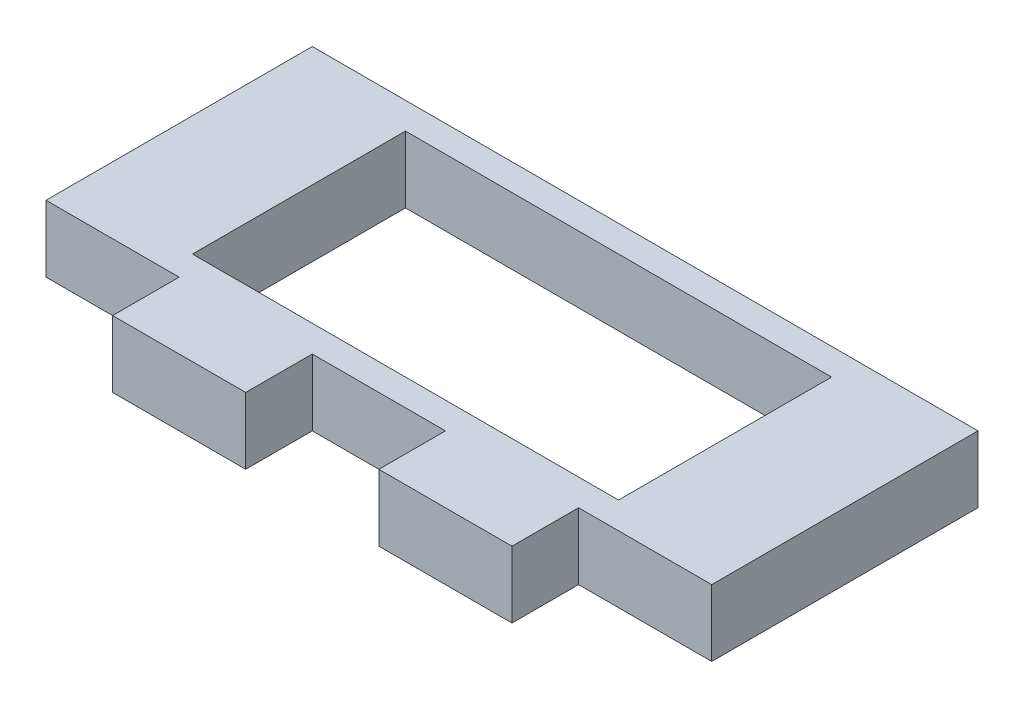
ISO-10303-21;
HEADER;
FILE_DESCRIPTION(('STEP AP214'),'2;1');
FILE_NAME('part.step','',(''),(''),'','','');
FILE_SCHEMA(('AUTOMOTIVE_DESIGN { 1 0 10303 214 1 1 1 1 }'));
ENDSEC;
DATA;
#1=APPLICATION_CONTEXT('core data for automotive mechanical design processes');
#2=APPLICATION_PROTOCOL_DEFINITION('international standard','automotive_design',2000,#1);
#3=PRODUCT_CONTEXT('',#1,'mechanical');
#4=PRODUCT('Part','Part','',(#3));
#5=PRODUCT_RELATED_PRODUCT_CATEGORY('part','',(#4));
#6=PRODUCT_DEFINITION_FORMATION('','',#4);
#7=PRODUCT_DEFINITION_CONTEXT('part definition',#1,'design');
#8=PRODUCT_DEFINITION('design','',#6,#7);
#9=PRODUCT_DEFINITION_SHAPE('','',#8);
#10=(LENGTH_UNIT() NAMED_UNIT(*) SI_UNIT(.MILLI.,.METRE.));
#11=(NAMED_UNIT(*) PLANE_ANGLE_UNIT() SI_UNIT($,.RADIAN.));
#12=(NAMED_UNIT(*) SI_UNIT($,.STERADIAN.) SOLID_ANGLE_UNIT());
#13=UNCERTAINTY_MEASURE_WITH_UNIT(LENGTH_MEASURE(1.E-05),#10,'distance_accuracy_value','');
#14=(GEOMETRIC_REPRESENTATION_CONTEXT(3) GLOBAL_UNCERTAINTY_ASSIGNED_CONTEXT((#13)) GLOBAL_UNIT_ASSIGNED_CONTEXT((#10,
#11,#12)) REPRESENTATION_CONTEXT('',''));
#15=CARTESIAN_POINT('',(0.,0.,0.));
#16=DIRECTION('',(0.,0.,1.));
#17=DIRECTION('',(1.,0.,0.));
#18=AXIS2_PLACEMENT_3D('',#15,#16,#17);
#19=CARTESIAN_POINT('',(0.,6.35,0.));
#20=DIRECTION('',(0.,1.,0.));
#21=DIRECTION('',(0.,0.,1.));
#22=AXIS2_PLACEMENT_3D('',#19,#20,#21);
#23=PLANE('',#22);
#24=DIRECTION('',(0.,0.,1.));
#25=VECTOR('',#24,1.);
#26=CARTESIAN_POINT('',(-31.75,6.35,-12.7));
#27=LINE('',#26,#25);
#28=CARTESIAN_POINT('',(-31.75,6.35,-12.7));
#29=VERTEX_POINT('',#28);
#30=CARTESIAN_POINT('',(-31.75,6.35,12.7));
#31=VERTEX_POINT('',#30);
#32=EDGE_CURVE('E182',#29,#31,#27,.T.);
#33=ORIENTED_EDGE('',*,*,#32,.T.);
#34=DIRECTION('',(1.,0.,0.));
#35=VECTOR('',#34,1.);
#36=CARTESIAN_POINT('',(-31.75,6.35,12.7));
#37=LINE('',#36,#35);
#38=CARTESIAN_POINT('',(-19.05,6.35,12.7));
#39=VERTEX_POINT('',#38);
#40=EDGE_CURVE('E185',#31,#39,#37,.T.);
#41=ORIENTED_EDGE('',*,*,#40,.T.);
#42=DIRECTION('',(0.,0.,1.));
#43=VECTOR('',#42,1.);
#44=CARTESIAN_POINT('',(-19.05,6.35,12.7));
#45=LINE('',#44,#43);
#46=CARTESIAN_POINT('',(-19.05,6.35,19.05));
#47=VERTEX_POINT('',#46);
#48=EDGE_CURVE('E188',#39,#47,#45,.T.);
#49=ORIENTED_EDGE('',*,*,#48,.T.);
#50=DIRECTION('',(1.,0.,0.));
#51=VECTOR('',#50,1.);
#52=CARTESIAN_POINT('',(-19.05,6.35,19.05));
#53=LINE('',#52,#51);
#54=CARTESIAN_POINT('',(-6.35,6.35,19.05));
#55=VERTEX_POINT('',#54);
#56=EDGE_CURVE('E190',#47,#55,#53,.T.);
#57=ORIENTED_EDGE('',*,*,#56,.T.);
#58=DIRECTION('',(0.,0.,-1.));
#59=VECTOR('',#58,1.);
#60=CARTESIAN_POINT('',(-6.35,6.35,12.7));
#61=LINE('',#60,#59);
#62=CARTESIAN_POINT('',(-6.35,6.35,12.7));
#63=VERTEX_POINT('',#62);
#64=EDGE_CURVE('E192',#55,#63,#61,.T.);
#65=ORIENTED_EDGE('',*,*,#64,.T.);
#66=DIRECTION('',(1.,0.,0.));
#67=VECTOR('',#66,1.);
#68=CARTESIAN_POINT('',(-6.35,6.35,12.7));
#69=LINE('',#68,#67);
#70=CARTESIAN_POINT('',(6.35,6.35,12.7));
#71=VERTEX_POINT('',#70);
#72=EDGE_CURVE('E194',#63,#71,#69,.T.);
#73=ORIENTED_EDGE('',*,*,#72,.T.);
#74=DIRECTION('',(0.,0.,1.));
#75=VECTOR('',#74,1.);
#76=CARTESIAN_POINT('',(6.35,6.35,12.7));
#77=LINE('',#76,#75);
#78=CARTESIAN_POINT('',(6.35,6.35,19.05));
#79=VERTEX_POINT('',#78);
#80=EDGE_CURVE('E196',#71,#79,#77,.T.);
#81=ORIENTED_EDGE('',*,*,#80,.T.);
#82=DIRECTION('',(1.,0.,0.));
#83=VECTOR('',#82,1.);
#84=CARTESIAN_POINT('',(6.35,6.35,19.05));
#85=LINE('',#84,#83);
#86=CARTESIAN_POINT('',(19.05,6.35,19.05));
#87=VERTEX_POINT('',#86);
#88=EDGE_CURVE('E198',#79,#87,#85,.T.);
#89=ORIENTED_EDGE('',*,*,#88,.T.);
#90=DIRECTION('',(0.,0.,-1.));
#91=VECTOR('',#90,1.);
#92=CARTESIAN_POINT('',(19.05,6.35,12.7));
#93=LINE('',#92,#91);
#94=CARTESIAN_POINT('',(19.05,6.35,12.7));
#95=VERTEX_POINT('',#94);
#96=EDGE_CURVE('E200',#87,#95,#93,.T.);
#97=ORIENTED_EDGE('',*,*,#96,.T.);
#98=DIRECTION('',(1.,0.,0.));
#99=VECTOR('',#98,1.);
#100=CARTESIAN_POINT('',(19.05,6.35,12.7));
#101=LINE('',#100,#99);
#102=CARTESIAN_POINT('',(31.75,6.35,12.7));
#103=VERTEX_POINT('',#102);
#104=EDGE_CURVE('E202',#95,#103,#101,.T.);
#105=ORIENTED_EDGE('',*,*,#104,.T.);
#106=DIRECTION('',(0.,0.,-1.));
#107=VECTOR('',#106,1.);
#108=CARTESIAN_POINT('',(31.75,6.35,-12.7));
#109=LINE('',#108,#107);
#110=CARTESIAN_POINT('',(31.75,6.35,-12.7));
#111=VERTEX_POINT('',#110);
#112=EDGE_CURVE('E204',#103,#111,#109,.T.);
#113=ORIENTED_EDGE('',*,*,#112,.T.);
#114=DIRECTION('',(-1.,0.,0.));
#115=VECTOR('',#114,1.);
#116=CARTESIAN_POINT('',(-31.75,6.35,-12.7));
#117=LINE('',#116,#115);
#118=EDGE_CURVE('E206',#111,#29,#117,.T.);
#119=ORIENTED_EDGE('',*,*,#118,.T.);
#120=EDGE_LOOP('',(#33,#41,#49,#57,#65,#73,#81,#89,#97,#105,#113,#119));
#121=FACE_BOUND('',#120,.T.);
#122=DIRECTION('',(1.,0.,0.));
#123=VECTOR('',#122,1.);
#124=CARTESIAN_POINT('',(-20.32,6.35,10.16));
#125=LINE('',#124,#123);
#126=CARTESIAN_POINT('',(-20.32,6.35,10.16));
#127=VERTEX_POINT('',#126);
#128=CARTESIAN_POINT('',(20.32,6.35,10.16));
#129=VERTEX_POINT('',#128);
#130=EDGE_CURVE('E154',#127,#129,#125,.T.);
#131=ORIENTED_EDGE('',*,*,#130,.F.);
#132=DIRECTION('',(0.,0.,1.));
#133=VECTOR('',#132,1.);
#134=CARTESIAN_POINT('',(-20.32,6.35,-10.16));
#135=LINE('',#134,#133);
#136=CARTESIAN_POINT('',(-20.32,6.35,-10.16));
#137=VERTEX_POINT('',#136);
#138=EDGE_CURVE('E146',#137,#127,#135,.T.);
#139=ORIENTED_EDGE('',*,*,#138,.F.);
#140=DIRECTION('',(-1.,0.,0.));
#141=VECTOR('',#140,1.);
#142=CARTESIAN_POINT('',(-20.32,6.35,-10.16));
#143=LINE('',#142,#141);
#144=CARTESIAN_POINT('',(20.32,6.35,-10.16));
#145=VERTEX_POINT('',#144);
#146=EDGE_CURVE('E168',#145,#137,#143,.T.);
#147=ORIENTED_EDGE('',*,*,#146,.F.);
#148=DIRECTION('',(0.,0.,-1.));
#149=VECTOR('',#148,1.);
#150=CARTESIAN_POINT('',(20.32,6.35,-10.16));
#151=LINE('',#150,#149);
#152=EDGE_CURVE('E166',#129,#145,#151,.T.);
#153=ORIENTED_EDGE('',*,*,#152,.F.);
#154=EDGE_LOOP('',(#131,#139,#147,#153));
#155=FACE_BOUND('',#154,.T.);
#156=ADVANCED_FACE('F33',(#121,#155),#23,.T.);
#157=CARTESIAN_POINT('',(0.,0.,0.));
#158=DIRECTION('',(0.,1.,0.));
#159=DIRECTION('',(0.,0.,1.));
#160=AXIS2_PLACEMENT_3D('',#157,#158,#159);
#161=PLANE('',#160);
#162=DIRECTION('',(0.,0.,1.));
#163=VECTOR('',#162,1.);
#164=CARTESIAN_POINT('',(-31.75,0.,-12.7));
#165=LINE('',#164,#163);
#166=CARTESIAN_POINT('',(-31.75,0.,-12.7));
#167=VERTEX_POINT('',#166);
#168=CARTESIAN_POINT('',(-31.75,0.,12.7));
#169=VERTEX_POINT('',#168);
#170=EDGE_CURVE('E162',#167,#169,#165,.T.);
#171=ORIENTED_EDGE('',*,*,#170,.F.);
#172=DIRECTION('',(-1.,0.,0.));
#173=VECTOR('',#172,1.);
#174=CARTESIAN_POINT('',(-31.75,0.,-12.7));
#175=LINE('',#174,#173);
#176=CARTESIAN_POINT('',(31.75,0.,-12.7));
#177=VERTEX_POINT('',#176);
#178=EDGE_CURVE('E186',#177,#167,#175,.T.);
#179=ORIENTED_EDGE('',*,*,#178,.F.);
#180=DIRECTION('',(0.,0.,-1.));
#181=VECTOR('',#180,1.);
#182=CARTESIAN_POINT('',(31.75,0.,-12.7));
#183=LINE('',#182,#181);
#184=CARTESIAN_POINT('',(31.75,0.,12.7));
#185=VERTEX_POINT('',#184);
#186=EDGE_CURVE('E229',#185,#177,#183,.T.);
#187=ORIENTED_EDGE('',*,*,#186,.F.);
#188=DIRECTION('',(1.,0.,0.));
#189=VECTOR('',#188,1.);
#190=CARTESIAN_POINT('',(19.05,0.,12.7));
#191=LINE('',#190,#189);
#192=CARTESIAN_POINT('',(19.05,0.,12.7));
#193=VERTEX_POINT('',#192);
#194=EDGE_CURVE('E227',#193,#185,#191,.T.);
#195=ORIENTED_EDGE('',*,*,#194,.F.);
#196=DIRECTION('',(0.,0.,-1.));
#197=VECTOR('',#196,1.);
#198=CARTESIAN_POINT('',(19.05,0.,12.7));
#199=LINE('',#198,#197);
#200=CARTESIAN_POINT('',(19.05,0.,19.05));
#201=VERTEX_POINT('',#200);
#202=EDGE_CURVE('E225',#201,#193,#199,.T.);
#203=ORIENTED_EDGE('',*,*,#202,.F.);
#204=DIRECTION('',(1.,0.,0.));
#205=VECTOR('',#204,1.);
#206=CARTESIAN_POINT('',(6.35,0.,19.05));
#207=LINE('',#206,#205);
#208=CARTESIAN_POINT('',(6.35,0.,19.05));
#209=VERTEX_POINT('',#208);
#210=EDGE_CURVE('E223',#209,#201,#207,.T.);
#211=ORIENTED_EDGE('',*,*,#210,.F.);
#212=DIRECTION('',(0.,0.,1.));
#213=VECTOR('',#212,1.);
#214=CARTESIAN_POINT('',(6.35,0.,12.7));
#215=LINE('',#214,#213);
#216=CARTESIAN_POINT('',(6.35,0.,12.7));
#217=VERTEX_POINT('',#216);
#218=EDGE_CURVE('E221',#217,#209,#215,.T.);
#219=ORIENTED_EDGE('',*,*,#218,.F.);
#220=DIRECTION('',(1.,0.,0.));
#221=VECTOR('',#220,1.);
#222=CARTESIAN_POINT('',(-6.35,0.,12.7));
#223=LINE('',#222,#221);
#224=CARTESIAN_POINT('',(-6.35,0.,12.7));
#225=VERTEX_POINT('',#224);
#226=EDGE_CURVE('E219',#225,#217,#223,.T.);
#227=ORIENTED_EDGE('',*,*,#226,.F.);
#228=DIRECTION('',(0.,0.,-1.));
#229=VECTOR('',#228,1.);
#230=CARTESIAN_POINT('',(-6.35,0.,12.7));
#231=LINE('',#230,#229);
#232=CARTESIAN_POINT('',(-6.35,0.,19.05));
#233=VERTEX_POINT('',#232);
#234=EDGE_CURVE('E217',#233,#225,#231,.T.);
#235=ORIENTED_EDGE('',*,*,#234,.F.);
#236=DIRECTION('',(1.,0.,0.));
#237=VECTOR('',#236,1.);
#238=CARTESIAN_POINT('',(-19.05,0.,19.05));
#239=LINE('',#238,#237);
#240=CARTESIAN_POINT('',(-19.05,0.,19.05));
#241=VERTEX_POINT('',#240);
#242=EDGE_CURVE('E215',#241,#233,#239,.T.);
#243=ORIENTED_EDGE('',*,*,#242,.F.);
#244=DIRECTION('',(0.,0.,1.));
#245=VECTOR('',#244,1.);
#246=CARTESIAN_POINT('',(-19.05,0.,12.7));
#247=LINE('',#246,#245);
#248=CARTESIAN_POINT('',(-19.05,0.,12.7));
#249=VERTEX_POINT('',#248);
#250=EDGE_CURVE('E213',#249,#241,#247,.T.);
#251=ORIENTED_EDGE('',*,*,#250,.F.);
#252=DIRECTION('',(1.,0.,0.));
#253=VECTOR('',#252,1.);
#254=CARTESIAN_POINT('',(-31.75,0.,12.7));
#255=LINE('',#254,#253);
#256=EDGE_CURVE('E211',#169,#249,#255,.T.);
#257=ORIENTED_EDGE('',*,*,#256,.F.);
#258=EDGE_LOOP('',(#171,#179,#187,#195,#203,#211,#219,#227,#235,#243,#251,#257));
#259=FACE_BOUND('',#258,.T.);
#260=DIRECTION('',(0.,0.,1.));
#261=VECTOR('',#260,1.);
#262=CARTESIAN_POINT('',(-20.32,0.,-10.16));
#263=LINE('',#262,#261);
#264=CARTESIAN_POINT('',(-20.32,0.,-10.16));
#265=VERTEX_POINT('',#264);
#266=CARTESIAN_POINT('',(-20.32,0.,10.16));
#267=VERTEX_POINT('',#266);
#268=EDGE_CURVE('E56',#265,#267,#263,.T.);
#269=ORIENTED_EDGE('',*,*,#268,.T.);
#270=DIRECTION('',(1.,0.,0.));
#271=VECTOR('',#270,1.);
#272=CARTESIAN_POINT('',(-20.32,0.,10.16));
#273=LINE('',#272,#271);
#274=CARTESIAN_POINT('',(20.32,0.,10.16));
#275=VERTEX_POINT('',#274);
#276=EDGE_CURVE('E161',#267,#275,#273,.T.);
#277=ORIENTED_EDGE('',*,*,#276,.T.);
#278=DIRECTION('',(0.,0.,-1.));
#279=VECTOR('',#278,1.);
#280=CARTESIAN_POINT('',(20.32,0.,-10.16));
#281=LINE('',#280,#279);
#282=CARTESIAN_POINT('',(20.32,0.,-10.16));
#283=VERTEX_POINT('',#282);
#284=EDGE_CURVE('E174',#275,#283,#281,.T.);
#285=ORIENTED_EDGE('',*,*,#284,.T.);
#286=DIRECTION('',(-1.,0.,0.));
#287=VECTOR('',#286,1.);
#288=CARTESIAN_POINT('',(-20.32,0.,-10.16));
#289=LINE('',#288,#287);
#290=EDGE_CURVE('E155',#283,#265,#289,.T.);
#291=ORIENTED_EDGE('',*,*,#290,.T.);
#292=EDGE_LOOP('',(#269,#277,#285,#291));
#293=FACE_BOUND('',#292,.T.);
#294=ADVANCED_FACE('F271',(#259,#293),#161,.F.);
#295=CARTESIAN_POINT('',(-31.75,6.35,-12.7));
#296=DIRECTION('',(1.,0.,0.));
#297=DIRECTION('',(0.,0.,-1.));
#298=AXIS2_PLACEMENT_3D('',#295,#296,#297);
#299=PLANE('',#298);
#300=ORIENTED_EDGE('',*,*,#170,.T.);
#301=DIRECTION('',(0.,-1.,0.));
#302=VECTOR('',#301,1.);
#303=CARTESIAN_POINT('',(-31.75,6.35,12.7));
#304=LINE('',#303,#302);
#305=EDGE_CURVE('E11',#31,#169,#304,.T.);
#306=ORIENTED_EDGE('',*,*,#305,.F.);
#307=ORIENTED_EDGE('',*,*,#32,.F.);
#308=DIRECTION('',(0.,-1.,0.));
#309=VECTOR('',#308,1.);
#310=CARTESIAN_POINT('',(-31.75,6.35,-12.7));
#311=LINE('',#310,#309);
#312=EDGE_CURVE('E208',#29,#167,#311,.T.);
#313=ORIENTED_EDGE('',*,*,#312,.T.);
#314=EDGE_LOOP('',(#300,#306,#307,#313));
#315=FACE_BOUND('',#314,.T.);
#316=ADVANCED_FACE('F35',(#315),#299,.F.);
#317=CARTESIAN_POINT('',(-31.75,6.35,12.7));
#318=DIRECTION('',(0.,0.,-1.));
#319=DIRECTION('',(-1.,0.,0.));
#320=AXIS2_PLACEMENT_3D('',#317,#318,#319);
#321=PLANE('',#320);
#322=ORIENTED_EDGE('',*,*,#256,.T.);
#323=DIRECTION('',(0.,-1.,0.));
#324=VECTOR('',#323,1.);
#325=CARTESIAN_POINT('',(-19.05,6.35,12.7));
#326=LINE('',#325,#324);
#327=EDGE_CURVE('E41',#39,#249,#326,.T.);
#328=ORIENTED_EDGE('',*,*,#327,.F.);
#329=ORIENTED_EDGE('',*,*,#40,.F.);
#330=ORIENTED_EDGE('',*,*,#305,.T.);
#331=EDGE_LOOP('',(#322,#328,#329,#330));
#332=FACE_BOUND('',#331,.T.);
#333=ADVANCED_FACE('F288',(#332),#321,.F.);
#334=CARTESIAN_POINT('',(-19.05,6.35,12.7));
#335=DIRECTION('',(1.,0.,0.));
#336=DIRECTION('',(0.,0.,-1.));
#337=AXIS2_PLACEMENT_3D('',#334,#335,#336);
#338=PLANE('',#337);
#339=ORIENTED_EDGE('',*,*,#250,.T.);
#340=DIRECTION('',(0.,-1.,0.));
#341=VECTOR('',#340,1.);
#342=CARTESIAN_POINT('',(-19.05,6.35,19.05));
#343=LINE('',#342,#341);
#344=EDGE_CURVE('E258',#47,#241,#343,.T.);
#345=ORIENTED_EDGE('',*,*,#344,.F.);
#346=ORIENTED_EDGE('',*,*,#48,.F.);
#347=ORIENTED_EDGE('',*,*,#327,.T.);
#348=EDGE_LOOP('',(#339,#345,#346,#347));
#349=FACE_BOUND('',#348,.T.);
#350=ADVANCED_FACE('F265',(#349),#338,.F.);
#351=CARTESIAN_POINT('',(-19.05,6.35,19.05));
#352=DIRECTION('',(0.,0.,-1.));
#353=DIRECTION('',(-1.,0.,0.));
#354=AXIS2_PLACEMENT_3D('',#351,#352,#353);
#355=PLANE('',#354);
#356=ORIENTED_EDGE('',*,*,#242,.T.);
#357=DIRECTION('',(0.,-1.,0.));
#358=VECTOR('',#357,1.);
#359=CARTESIAN_POINT('',(-6.35,6.35,19.05));
#360=LINE('',#359,#358);
#361=EDGE_CURVE('E255',#55,#233,#360,.T.);
#362=ORIENTED_EDGE('',*,*,#361,.F.);
#363=ORIENTED_EDGE('',*,*,#56,.F.);
#364=ORIENTED_EDGE('',*,*,#344,.T.);
#365=EDGE_LOOP('',(#356,#362,#363,#364));
#366=FACE_BOUND('',#365,.T.);
#367=ADVANCED_FACE('F277',(#366),#355,.F.);
#368=CARTESIAN_POINT('',(-6.35,6.35,12.7));
#369=DIRECTION('',(-1.,0.,0.));
#370=DIRECTION('',(0.,0.,1.));
#371=AXIS2_PLACEMENT_3D('',#368,#369,#370);
#372=PLANE('',#371);
#373=ORIENTED_EDGE('',*,*,#234,.T.);
#374=DIRECTION('',(0.,-1.,0.));
#375=VECTOR('',#374,1.);
#376=CARTESIAN_POINT('',(-6.35,6.35,12.7));
#377=LINE('',#376,#375);
#378=EDGE_CURVE('E252',#63,#225,#377,.T.);
#379=ORIENTED_EDGE('',*,*,#378,.F.);
#380=ORIENTED_EDGE('',*,*,#64,.F.);
#381=ORIENTED_EDGE('',*,*,#361,.T.);
#382=EDGE_LOOP('',(#373,#379,#380,#381));
#383=FACE_BOUND('',#382,.T.);
#384=ADVANCED_FACE('F281',(#383),#372,.F.);
#385=CARTESIAN_POINT('',(-6.35,6.35,12.7));
#386=DIRECTION('',(0.,0.,-1.));
#387=DIRECTION('',(-1.,0.,0.));
#388=AXIS2_PLACEMENT_3D('',#385,#386,#387);
#389=PLANE('',#388);
#390=ORIENTED_EDGE('',*,*,#226,.T.);
#391=DIRECTION('',(0.,-1.,0.));
#392=VECTOR('',#391,1.);
#393=CARTESIAN_POINT('',(6.35,6.35,12.7));
#394=LINE('',#393,#392);
#395=EDGE_CURVE('E249',#71,#217,#394,.T.);
#396=ORIENTED_EDGE('',*,*,#395,.F.);
#397=ORIENTED_EDGE('',*,*,#72,.F.);
#398=ORIENTED_EDGE('',*,*,#378,.T.);
#399=EDGE_LOOP('',(#390,#396,#397,#398));
#400=FACE_BOUND('',#399,.T.);
#401=ADVANCED_FACE('F321',(#400),#389,.F.);
#402=CARTESIAN_POINT('',(6.35,6.35,12.7));
#403=DIRECTION('',(1.,0.,0.));
#404=DIRECTION('',(0.,0.,-1.));
#405=AXIS2_PLACEMENT_3D('',#402,#403,#404);
#406=PLANE('',#405);
#407=ORIENTED_EDGE('',*,*,#218,.T.);
#408=DIRECTION('',(0.,-1.,0.));
#409=VECTOR('',#408,1.);
#410=CARTESIAN_POINT('',(6.35,6.35,19.05));
#411=LINE('',#410,#409);
#412=EDGE_CURVE('E246',#79,#209,#411,.T.);
#413=ORIENTED_EDGE('',*,*,#412,.F.);
#414=ORIENTED_EDGE('',*,*,#80,.F.);
#415=ORIENTED_EDGE('',*,*,#395,.T.);
#416=EDGE_LOOP('',(#407,#413,#414,#415));
#417=FACE_BOUND('',#416,.T.);
#418=ADVANCED_FACE('F319',(#417),#406,.F.);
#419=CARTESIAN_POINT('',(6.35,6.35,19.05));
#420=DIRECTION('',(0.,0.,-1.));
#421=DIRECTION('',(-1.,0.,0.));
#422=AXIS2_PLACEMENT_3D('',#419,#420,#421);
#423=PLANE('',#422);
#424=ORIENTED_EDGE('',*,*,#210,.T.);
#425=DIRECTION('',(0.,-1.,0.));
#426=VECTOR('',#425,1.);
#427=CARTESIAN_POINT('',(19.05,6.35,19.05));
#428=LINE('',#427,#426);
#429=EDGE_CURVE('E243',#87,#201,#428,.T.);
#430=ORIENTED_EDGE('',*,*,#429,.F.);
#431=ORIENTED_EDGE('',*,*,#88,.F.);
#432=ORIENTED_EDGE('',*,*,#412,.T.);
#433=EDGE_LOOP('',(#424,#430,#431,#432));
#434=FACE_BOUND('',#433,.T.);
#435=ADVANCED_FACE('F315',(#434),#423,.F.);
#436=CARTESIAN_POINT('',(19.05,6.35,12.7));
#437=DIRECTION('',(-1.,0.,0.));
#438=DIRECTION('',(0.,0.,1.));
#439=AXIS2_PLACEMENT_3D('',#436,#437,#438);
#440=PLANE('',#439);
#441=ORIENTED_EDGE('',*,*,#202,.T.);
#442=DIRECTION('',(0.,-1.,0.));
#443=VECTOR('',#442,1.);
#444=CARTESIAN_POINT('',(19.05,6.35,12.7));
#445=LINE('',#444,#443);
#446=EDGE_CURVE('E240',#95,#193,#445,.T.);
#447=ORIENTED_EDGE('',*,*,#446,.F.);
#448=ORIENTED_EDGE('',*,*,#96,.F.);
#449=ORIENTED_EDGE('',*,*,#429,.T.);
#450=EDGE_LOOP('',(#441,#447,#448,#449));
#451=FACE_BOUND('',#450,.T.);
#452=ADVANCED_FACE('F310',(#451),#440,.F.);
#453=CARTESIAN_POINT('',(19.05,6.35,12.7));
#454=DIRECTION('',(0.,0.,-1.));
#455=DIRECTION('',(-1.,0.,0.));
#456=AXIS2_PLACEMENT_3D('',#453,#454,#455);
#457=PLANE('',#456);
#458=ORIENTED_EDGE('',*,*,#194,.T.);
#459=DIRECTION('',(0.,-1.,0.));
#460=VECTOR('',#459,1.);
#461=CARTESIAN_POINT('',(31.75,6.35,12.7));
#462=LINE('',#461,#460);
#463=EDGE_CURVE('E237',#103,#185,#462,.T.);
#464=ORIENTED_EDGE('',*,*,#463,.F.);
#465=ORIENTED_EDGE('',*,*,#104,.F.);
#466=ORIENTED_EDGE('',*,*,#446,.T.);
#467=EDGE_LOOP('',(#458,#464,#465,#466));
#468=FACE_BOUND('',#467,.T.);
#469=ADVANCED_FACE('F304',(#468),#457,.F.);
#470=CARTESIAN_POINT('',(31.75,6.35,-12.7));
#471=DIRECTION('',(-1.,0.,0.));
#472=DIRECTION('',(0.,0.,1.));
#473=AXIS2_PLACEMENT_3D('',#470,#471,#472);
#474=PLANE('',#473);
#475=ORIENTED_EDGE('',*,*,#186,.T.);
#476=DIRECTION('',(0.,-1.,0.));
#477=VECTOR('',#476,1.);
#478=CARTESIAN_POINT('',(31.75,6.35,-12.7));
#479=LINE('',#478,#477);
#480=EDGE_CURVE('E234',#111,#177,#479,.T.);
#481=ORIENTED_EDGE('',*,*,#480,.F.);
#482=ORIENTED_EDGE('',*,*,#112,.F.);
#483=ORIENTED_EDGE('',*,*,#463,.T.);
#484=EDGE_LOOP('',(#475,#481,#482,#483));
#485=FACE_BOUND('',#484,.T.);
#486=ADVANCED_FACE('F300',(#485),#474,.F.);
#487=CARTESIAN_POINT('',(-31.75,6.35,-12.7));
#488=DIRECTION('',(0.,0.,1.));
#489=DIRECTION('',(1.,0.,0.));
#490=AXIS2_PLACEMENT_3D('',#487,#488,#489);
#491=PLANE('',#490);
#492=ORIENTED_EDGE('',*,*,#178,.T.);
#493=ORIENTED_EDGE('',*,*,#312,.F.);
#494=ORIENTED_EDGE('',*,*,#118,.F.);
#495=ORIENTED_EDGE('',*,*,#480,.T.);
#496=EDGE_LOOP('',(#492,#493,#494,#495));
#497=FACE_BOUND('',#496,.T.);
#498=ADVANCED_FACE('F295',(#497),#491,.F.);
#499=CARTESIAN_POINT('',(-20.32,6.35,-10.16));
#500=DIRECTION('',(1.,0.,0.));
#501=DIRECTION('',(0.,0.,-1.));
#502=AXIS2_PLACEMENT_3D('',#499,#500,#501);
#503=PLANE('',#502);
#504=ORIENTED_EDGE('',*,*,#268,.F.);
#505=DIRECTION('',(0.,-1.,0.));
#506=VECTOR('',#505,1.);
#507=CARTESIAN_POINT('',(-20.32,6.35,-10.16));
#508=LINE('',#507,#506);
#509=EDGE_CURVE('E150',#137,#265,#508,.T.);
#510=ORIENTED_EDGE('',*,*,#509,.F.);
#511=ORIENTED_EDGE('',*,*,#138,.T.);
#512=DIRECTION('',(0.,-1.,0.));
#513=VECTOR('',#512,1.);
#514=CARTESIAN_POINT('',(-20.32,6.35,10.16));
#515=LINE('',#514,#513);
#516=EDGE_CURVE('E149',#127,#267,#515,.T.);
#517=ORIENTED_EDGE('',*,*,#516,.T.);
#518=EDGE_LOOP('',(#504,#510,#511,#517));
#519=FACE_BOUND('',#518,.T.);
#520=ADVANCED_FACE('F148',(#519),#503,.T.);
#521=CARTESIAN_POINT('',(-20.32,6.35,10.16));
#522=DIRECTION('',(0.,0.,-1.));
#523=DIRECTION('',(-1.,0.,0.));
#524=AXIS2_PLACEMENT_3D('',#521,#522,#523);
#525=PLANE('',#524);
#526=ORIENTED_EDGE('',*,*,#276,.F.);
#527=ORIENTED_EDGE('',*,*,#516,.F.);
#528=ORIENTED_EDGE('',*,*,#130,.T.);
#529=DIRECTION('',(0.,-1.,0.));
#530=VECTOR('',#529,1.);
#531=CARTESIAN_POINT('',(20.32,6.35,10.16));
#532=LINE('',#531,#530);
#533=EDGE_CURVE('E163',#129,#275,#532,.T.);
#534=ORIENTED_EDGE('',*,*,#533,.T.);
#535=EDGE_LOOP('',(#526,#527,#528,#534));
#536=FACE_BOUND('',#535,.T.);
#537=ADVANCED_FACE('F158',(#536),#525,.T.);
#538=CARTESIAN_POINT('',(20.32,6.35,-10.16));
#539=DIRECTION('',(-1.,0.,0.));
#540=DIRECTION('',(0.,0.,1.));
#541=AXIS2_PLACEMENT_3D('',#538,#539,#540);
#542=PLANE('',#541);
#543=ORIENTED_EDGE('',*,*,#284,.F.);
#544=ORIENTED_EDGE('',*,*,#533,.F.);
#545=ORIENTED_EDGE('',*,*,#152,.T.);
#546=DIRECTION('',(0.,-1.,0.));
#547=VECTOR('',#546,1.);
#548=CARTESIAN_POINT('',(20.32,6.35,-10.16));
#549=LINE('',#548,#547);
#550=EDGE_CURVE('E48',#145,#283,#549,.T.);
#551=ORIENTED_EDGE('',*,*,#550,.T.);
#552=EDGE_LOOP('',(#543,#544,#545,#551));
#553=FACE_BOUND('',#552,.T.);
#554=ADVANCED_FACE('F379',(#553),#542,.T.);
#555=CARTESIAN_POINT('',(-20.32,6.35,-10.16));
#556=DIRECTION('',(0.,0.,1.));
#557=DIRECTION('',(1.,0.,0.));
#558=AXIS2_PLACEMENT_3D('',#555,#556,#557);
#559=PLANE('',#558);
#560=ORIENTED_EDGE('',*,*,#290,.F.);
#561=ORIENTED_EDGE('',*,*,#550,.F.);
#562=ORIENTED_EDGE('',*,*,#146,.T.);
#563=ORIENTED_EDGE('',*,*,#509,.T.);
#564=EDGE_LOOP('',(#560,#561,#562,#563));
#565=FACE_BOUND('',#564,.T.);
#566=ADVANCED_FACE('F385',(#565),#559,.T.);
#567=CLOSED_SHELL('',(#156,#294,#316,#333,#350,#367,#384,#401,#418,#435,#452,#469,#486,#498,
#520,#537,#554,#566));
#568=MANIFOLD_SOLID_BREP('B2',#567);
#569=ADVANCED_BREP_SHAPE_REPRESENTATION('',(#18,#568),#14);
#570=SHAPE_DEFINITION_REPRESENTATION(#9,#569);
ENDSEC;
END-ISO-10303-21;
